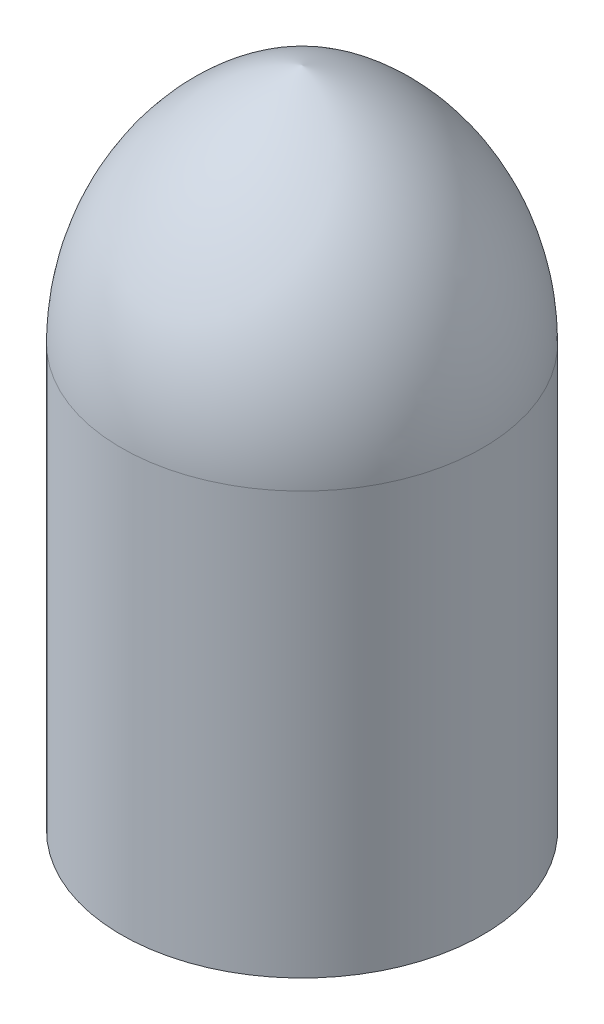
ISO-10303-21;
HEADER;
FILE_DESCRIPTION(('STEP AP214'),'2;1');
FILE_NAME('part.step','',(''),(''),'','','');
FILE_SCHEMA(('AUTOMOTIVE_DESIGN { 1 0 10303 214 1 1 1 1 }'));
ENDSEC;
DATA;
#1=APPLICATION_CONTEXT('core data for automotive mechanical design processes');
#2=APPLICATION_PROTOCOL_DEFINITION('international standard','automotive_design',2000,#1);
#3=PRODUCT_CONTEXT('',#1,'mechanical');
#4=PRODUCT('Part','Part','',(#3));
#5=PRODUCT_RELATED_PRODUCT_CATEGORY('part','',(#4));
#6=PRODUCT_DEFINITION_FORMATION('','',#4);
#7=PRODUCT_DEFINITION_CONTEXT('part definition',#1,'design');
#8=PRODUCT_DEFINITION('design','',#6,#7);
#9=PRODUCT_DEFINITION_SHAPE('','',#8);
#10=(LENGTH_UNIT() NAMED_UNIT(*) SI_UNIT(.MILLI.,.METRE.));
#11=(NAMED_UNIT(*) PLANE_ANGLE_UNIT() SI_UNIT($,.RADIAN.));
#12=(NAMED_UNIT(*) SI_UNIT($,.STERADIAN.) SOLID_ANGLE_UNIT());
#13=UNCERTAINTY_MEASURE_WITH_UNIT(LENGTH_MEASURE(1.E-05),#10,'distance_accuracy_value','');
#14=(GEOMETRIC_REPRESENTATION_CONTEXT(3) GLOBAL_UNCERTAINTY_ASSIGNED_CONTEXT((#13)) GLOBAL_UNIT_ASSIGNED_CONTEXT((#10,
#11,#12)) REPRESENTATION_CONTEXT('',''));
#15=CARTESIAN_POINT('',(0.,0.,0.));
#16=DIRECTION('',(0.,0.,1.));
#17=DIRECTION('',(1.,0.,0.));
#18=AXIS2_PLACEMENT_3D('',#15,#16,#17);
#19=CARTESIAN_POINT('',(0.,0.,0.));
#20=DIRECTION('',(0.,1.,0.));
#21=DIRECTION('',(-1.,0.,0.));
#22=AXIS2_PLACEMENT_3D('',#19,#20,#21);
#23=PLANE('',#22);
#24=CARTESIAN_POINT('',(0.,0.,0.));
#25=DIRECTION('',(0.,1.,0.));
#26=DIRECTION('',(-1.,0.,0.));
#27=AXIS2_PLACEMENT_3D('',#24,#25,#26);
#28=CIRCLE('',#27,58.);
#29=CARTESIAN_POINT('',(-58.,0.,0.));
#30=VERTEX_POINT('',#29);
#31=EDGE_CURVE('E57',#30,#30,#28,.T.);
#32=ORIENTED_EDGE('',*,*,#31,.T.);
#33=EDGE_LOOP('',(#32));
#34=FACE_BOUND('',#33,.T.);
#35=CARTESIAN_POINT('',(0.,0.,0.));
#36=DIRECTION('',(0.,1.,0.));
#37=DIRECTION('',(-1.,0.,0.));
#38=AXIS2_PLACEMENT_3D('',#35,#36,#37);
#39=CIRCLE('',#38,60.);
#40=CARTESIAN_POINT('',(-60.,0.,0.));
#41=VERTEX_POINT('',#40);
#42=EDGE_CURVE('E11',#41,#41,#39,.T.);
#43=ORIENTED_EDGE('',*,*,#42,.F.);
#44=EDGE_LOOP('',(#43));
#45=FACE_BOUND('',#44,.T.);
#46=ADVANCED_FACE('F35',(#34,#45),#23,.F.);
#47=CARTESIAN_POINT('',(0.,220.,0.));
#48=DIRECTION('',(0.,1.,0.));
#49=DIRECTION('',(-1.,0.,0.));
#50=AXIS2_PLACEMENT_3D('',#47,#48,#49);
#51=CYLINDRICAL_SURFACE('',#50,60.);
#52=CARTESIAN_POINT('',(0.,140.,0.));
#53=DIRECTION('',(0.,1.,0.));
#54=DIRECTION('',(-1.,0.,0.));
#55=AXIS2_PLACEMENT_3D('',#52,#53,#54);
#56=CIRCLE('',#55,60.);
#57=CARTESIAN_POINT('',(-60.,140.,0.));
#58=VERTEX_POINT('',#57);
#59=EDGE_CURVE('E42',#58,#58,#56,.T.);
#60=ORIENTED_EDGE('',*,*,#59,.F.);
#61=EDGE_LOOP('',(#60));
#62=FACE_BOUND('',#61,.T.);
#63=ORIENTED_EDGE('',*,*,#42,.T.);
#64=EDGE_LOOP('',(#63));
#65=FACE_BOUND('',#64,.T.);
#66=ADVANCED_FACE('F66',(#62,#65),#51,.T.);
#67=CARTESIAN_POINT('',(23.3333333333333,140.,0.));
#68=DIRECTION('',(0.,0.,-1.));
#69=DIRECTION('',(-1.,0.,0.));
#70=AXIS2_PLACEMENT_3D('',#67,#68,#69);
#71=CIRCLE('',#70,83.3333333333333);
#72=TRIMMED_CURVE('',#71,(PARAMETER_VALUE(-1.28700221758657)),
(PARAMETER_VALUE(1.28700221758657)),.T.,.PARAMETER.);
#73=CARTESIAN_POINT('',(0.,140.,0.));
#74=DIRECTION('',(0.,1.,0.));
#75=AXIS1_PLACEMENT('',#73,#74);
#76=SURFACE_OF_REVOLUTION('',#72,#75);
#77=CARTESIAN_POINT('',(0.,220.,0.));
#78=VERTEX_POINT('',#77);
#79=VERTEX_LOOP('',#78);
#80=FACE_BOUND('',#79,.T.);
#81=ORIENTED_EDGE('',*,*,#59,.T.);
#82=EDGE_LOOP('',(#81));
#83=FACE_BOUND('',#82,.T.);
#84=ADVANCED_FACE('F64',(#80,#83),#76,.T.);
#85=CARTESIAN_POINT('',(0.,220.,0.));
#86=DIRECTION('',(0.,1.,0.));
#87=DIRECTION('',(-1.,0.,0.));
#88=AXIS2_PLACEMENT_3D('',#85,#86,#87);
#89=CYLINDRICAL_SURFACE('',#88,58.);
#90=CARTESIAN_POINT('',(0.,140.,0.));
#91=DIRECTION('',(0.,1.,0.));
#92=DIRECTION('',(-1.,0.,0.));
#93=AXIS2_PLACEMENT_3D('',#90,#91,#92);
#94=CIRCLE('',#93,58.);
#95=CARTESIAN_POINT('',(-58.,140.,0.));
#96=VERTEX_POINT('',#95);
#97=EDGE_CURVE('E55',#96,#96,#94,.T.);
#98=ORIENTED_EDGE('',*,*,#97,.T.);
#99=EDGE_LOOP('',(#98));
#100=FACE_BOUND('',#99,.T.);
#101=ORIENTED_EDGE('',*,*,#31,.F.);
#102=EDGE_LOOP('',(#101));
#103=FACE_BOUND('',#102,.T.);
#104=ADVANCED_FACE('F51',(#100,#103),#89,.F.);
#105=CARTESIAN_POINT('',(23.3333333333333,140.,0.));
#106=DIRECTION('',(0.,0.,-1.));
#107=DIRECTION('',(-1.,0.,0.));
#108=AXIS2_PLACEMENT_3D('',#105,#106,#107);
#109=CIRCLE('',#108,81.3333333333333);
#110=TRIMMED_CURVE('',#109,(PARAMETER_VALUE(-1.27982250733635)),
(PARAMETER_VALUE(1.27982250733635)),.T.,.PARAMETER.);
#111=CARTESIAN_POINT('',(0.,140.,0.));
#112=DIRECTION('',(0.,1.,0.));
#113=AXIS1_PLACEMENT('',#111,#112);
#114=SURFACE_OF_REVOLUTION('',#110,#113);
#115=CARTESIAN_POINT('',(0.,217.914483035355,0.));
#116=VERTEX_POINT('',#115);
#117=VERTEX_LOOP('',#116);
#118=FACE_BOUND('',#117,.T.);
#119=ORIENTED_EDGE('',*,*,#97,.F.);
#120=EDGE_LOOP('',(#119));
#121=FACE_BOUND('',#120,.T.);
#122=ADVANCED_FACE('F48',(#118,#121),#114,.F.);
#123=CLOSED_SHELL('',(#46,#66,#84,#104,#122));
#124=MANIFOLD_SOLID_BREP('B2',#123);
#125=ADVANCED_BREP_SHAPE_REPRESENTATION('',(#18,#124),#14);
#126=SHAPE_DEFINITION_REPRESENTATION(#9,#125);
ENDSEC;
END-ISO-10303-21;
